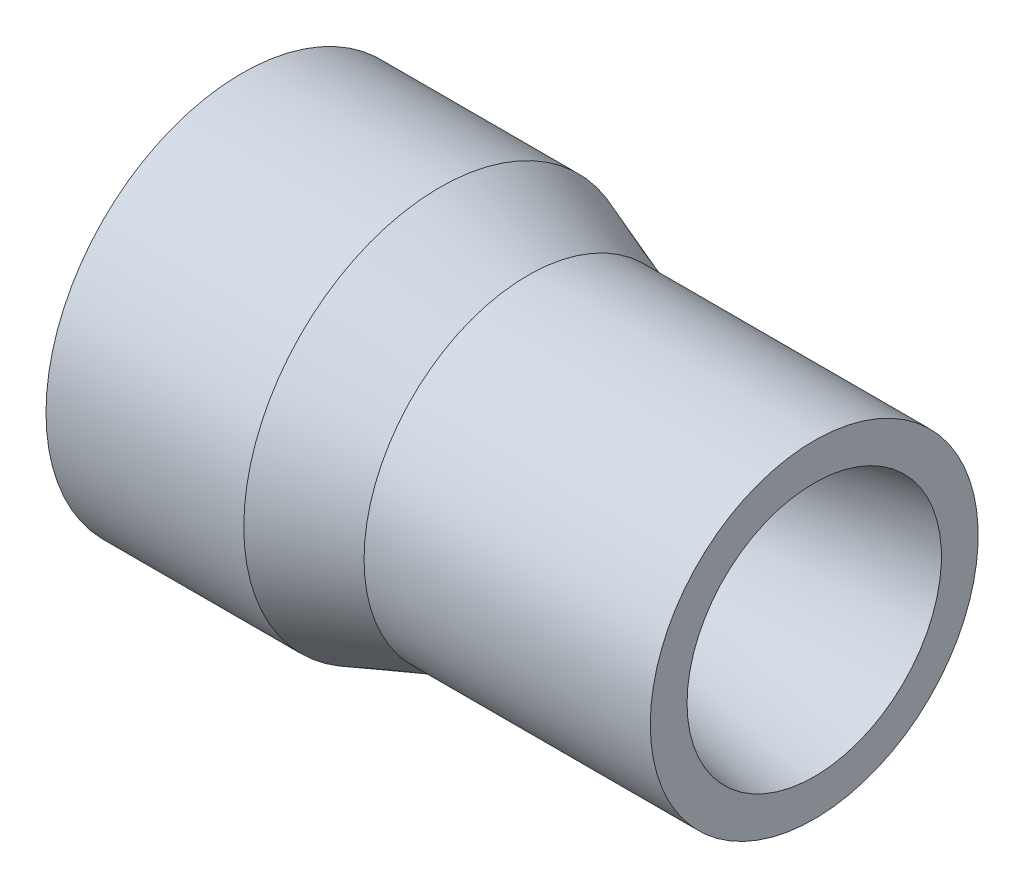
ISO-10303-21;
HEADER;
FILE_DESCRIPTION(('STEP AP214'),'2;1');
FILE_NAME('part.step','',(''),(''),'','','');
FILE_SCHEMA(('AUTOMOTIVE_DESIGN { 1 0 10303 214 1 1 1 1 }'));
ENDSEC;
DATA;
#1=APPLICATION_CONTEXT('core data for automotive mechanical design processes');
#2=APPLICATION_PROTOCOL_DEFINITION('international standard','automotive_design',2000,#1);
#3=PRODUCT_CONTEXT('',#1,'mechanical');
#4=PRODUCT('Part','Part','',(#3));
#5=PRODUCT_RELATED_PRODUCT_CATEGORY('part','',(#4));
#6=PRODUCT_DEFINITION_FORMATION('','',#4);
#7=PRODUCT_DEFINITION_CONTEXT('part definition',#1,'design');
#8=PRODUCT_DEFINITION('design','',#6,#7);
#9=PRODUCT_DEFINITION_SHAPE('','',#8);
#10=(LENGTH_UNIT() NAMED_UNIT(*) SI_UNIT(.MILLI.,.METRE.));
#11=(NAMED_UNIT(*) PLANE_ANGLE_UNIT() SI_UNIT($,.RADIAN.));
#12=(NAMED_UNIT(*) SI_UNIT($,.STERADIAN.) SOLID_ANGLE_UNIT());
#13=UNCERTAINTY_MEASURE_WITH_UNIT(LENGTH_MEASURE(1.E-05),#10,'distance_accuracy_value','');
#14=(GEOMETRIC_REPRESENTATION_CONTEXT(3) GLOBAL_UNCERTAINTY_ASSIGNED_CONTEXT((#13)) GLOBAL_UNIT_ASSIGNED_CONTEXT((#10,
#11,#12)) REPRESENTATION_CONTEXT('',''));
#15=CARTESIAN_POINT('',(0.,0.,0.));
#16=DIRECTION('',(0.,0.,1.));
#17=DIRECTION('',(1.,0.,0.));
#18=AXIS2_PLACEMENT_3D('',#15,#16,#17);
#19=CARTESIAN_POINT('',(0.140252987646805,0.,0.));
#20=DIRECTION('',(-1.,0.,0.));
#21=DIRECTION('',(0.,0.,1.));
#22=AXIS2_PLACEMENT_3D('',#19,#20,#21);
#23=DEGENERATE_TOROIDAL_SURFACE('',#22,44.3148851132243,85.61,.F.);
#24=CARTESIAN_POINT('',(42.9452529876469,0.,0.));
#25=DIRECTION('',(-1.,0.,0.));
#26=DIRECTION('',(0.,0.,1.));
#27=AXIS2_PLACEMENT_3D('',#24,#25,#26);
#28=CIRCLE('',#27,29.8255497047615);
#29=CARTESIAN_POINT('',(42.9452529876469,0.,29.8255497047615));
#30=VERTEX_POINT('',#29);
#31=EDGE_CURVE('E82',#30,#30,#28,.T.);
#32=ORIENTED_EDGE('',*,*,#31,.F.);
#33=EDGE_LOOP('',(#32));
#34=FACE_BOUND('',#33,.T.);
#35=CARTESIAN_POINT('',(0.,0.,0.));
#36=DIRECTION('',(-1.,0.,0.));
#37=DIRECTION('',(0.,0.,1.));
#38=AXIS2_PLACEMENT_3D('',#35,#36,#37);
#39=CIRCLE('',#38,41.295);
#40=CARTESIAN_POINT('',(0.,0.,41.295));
#41=VERTEX_POINT('',#40);
#42=EDGE_CURVE('E10',#41,#41,#39,.T.);
#43=ORIENTED_EDGE('',*,*,#42,.T.);
#44=EDGE_LOOP('',(#43));
#45=FACE_BOUND('',#44,.T.);
#46=ADVANCED_FACE('F39',(#34,#45),#23,.T.);
#47=CARTESIAN_POINT('',(0.,41.295,0.));
#48=DIRECTION('',(1.,0.,0.));
#49=DIRECTION('',(0.,0.,-1.));
#50=AXIS2_PLACEMENT_3D('',#47,#48,#49);
#51=PLANE('',#50);
#52=ORIENTED_EDGE('',*,*,#42,.F.);
#53=EDGE_LOOP('',(#52));
#54=FACE_BOUND('',#53,.T.);
#55=CARTESIAN_POINT('',(0.,0.,0.));
#56=DIRECTION('',(-1.,0.,0.));
#57=DIRECTION('',(0.,0.,1.));
#58=AXIS2_PLACEMENT_3D('',#55,#56,#57);
#59=CIRCLE('',#58,50.82);
#60=CARTESIAN_POINT('',(0.,0.,50.82));
#61=VERTEX_POINT('',#60);
#62=EDGE_CURVE('E46',#61,#61,#59,.T.);
#63=ORIENTED_EDGE('',*,*,#62,.T.);
#64=EDGE_LOOP('',(#63));
#65=FACE_BOUND('',#64,.T.);
#66=ADVANCED_FACE('F114',(#54,#65),#51,.F.);
#67=CARTESIAN_POINT('',(0.,0.,0.));
#68=DIRECTION('',(-1.,0.,0.));
#69=DIRECTION('',(0.,0.,1.));
#70=AXIS2_PLACEMENT_3D('',#67,#68,#69);
#71=CYLINDRICAL_SURFACE('',#70,50.82);
#72=ORIENTED_EDGE('',*,*,#62,.F.);
#73=EDGE_LOOP('',(#72));
#74=FACE_BOUND('',#73,.T.);
#75=CARTESIAN_POINT('',(51.2709878701376,0.,0.));
#76=DIRECTION('',(-1.,0.,0.));
#77=DIRECTION('',(0.,0.,1.));
#78=AXIS2_PLACEMENT_3D('',#75,#76,#77);
#79=CIRCLE('',#78,50.82);
#80=CARTESIAN_POINT('',(51.2709878701376,0.,50.82));
#81=VERTEX_POINT('',#80);
#82=EDGE_CURVE('E51',#81,#81,#79,.T.);
#83=ORIENTED_EDGE('',*,*,#82,.T.);
#84=EDGE_LOOP('',(#83));
#85=FACE_BOUND('',#84,.T.);
#86=ADVANCED_FACE('F111',(#74,#85),#71,.T.);
#87=CARTESIAN_POINT('',(74.13,0.,0.));
#88=DIRECTION('',(-1.,0.,0.));
#89=DIRECTION('',(0.,0.,1.));
#90=AXIS2_PLACEMENT_3D('',#87,#88,#89);
#91=CONICAL_SURFACE('',#90,42.5,0.349065850398867);
#92=ORIENTED_EDGE('',*,*,#82,.F.);
#93=EDGE_LOOP('',(#92));
#94=FACE_BOUND('',#93,.T.);
#95=CARTESIAN_POINT('',(74.13,0.,0.));
#96=DIRECTION('',(-1.,0.,0.));
#97=DIRECTION('',(0.,0.,1.));
#98=AXIS2_PLACEMENT_3D('',#95,#96,#97);
#99=CIRCLE('',#98,42.5);
#100=CARTESIAN_POINT('',(74.13,0.,42.5));
#101=VERTEX_POINT('',#100);
#102=EDGE_CURVE('E56',#101,#101,#99,.T.);
#103=ORIENTED_EDGE('',*,*,#102,.T.);
#104=EDGE_LOOP('',(#103));
#105=FACE_BOUND('',#104,.T.);
#106=ADVANCED_FACE('F107',(#94,#105),#91,.T.);
#107=CARTESIAN_POINT('',(0.,0.,0.));
#108=DIRECTION('',(-1.,0.,0.));
#109=DIRECTION('',(0.,0.,1.));
#110=AXIS2_PLACEMENT_3D('',#107,#108,#109);
#111=CYLINDRICAL_SURFACE('',#110,42.5);
#112=ORIENTED_EDGE('',*,*,#102,.F.);
#113=EDGE_LOOP('',(#112));
#114=FACE_BOUND('',#113,.T.);
#115=CARTESIAN_POINT('',(148.34,0.,0.));
#116=DIRECTION('',(-1.,0.,0.));
#117=DIRECTION('',(0.,0.,1.));
#118=AXIS2_PLACEMENT_3D('',#115,#116,#117);
#119=CIRCLE('',#118,42.5);
#120=CARTESIAN_POINT('',(148.34,0.,42.5));
#121=VERTEX_POINT('',#120);
#122=EDGE_CURVE('E62',#121,#121,#119,.T.);
#123=ORIENTED_EDGE('',*,*,#122,.T.);
#124=EDGE_LOOP('',(#123));
#125=FACE_BOUND('',#124,.T.);
#126=ADVANCED_FACE('F103',(#114,#125),#111,.T.);
#127=CARTESIAN_POINT('',(148.34,32.975,0.));
#128=DIRECTION('',(-1.,0.,0.));
#129=DIRECTION('',(0.,0.,1.));
#130=AXIS2_PLACEMENT_3D('',#127,#128,#129);
#131=PLANE('',#130);
#132=ORIENTED_EDGE('',*,*,#122,.F.);
#133=EDGE_LOOP('',(#132));
#134=FACE_BOUND('',#133,.T.);
#135=CARTESIAN_POINT('',(148.34,0.,0.));
#136=DIRECTION('',(-1.,0.,0.));
#137=DIRECTION('',(0.,0.,1.));
#138=AXIS2_PLACEMENT_3D('',#135,#136,#137);
#139=CIRCLE('',#138,32.975);
#140=CARTESIAN_POINT('',(148.34,0.,32.975));
#141=VERTEX_POINT('',#140);
#142=EDGE_CURVE('E66',#141,#141,#139,.T.);
#143=ORIENTED_EDGE('',*,*,#142,.T.);
#144=EDGE_LOOP('',(#143));
#145=FACE_BOUND('',#144,.T.);
#146=ADVANCED_FACE('F98',(#134,#145),#131,.F.);
#147=CARTESIAN_POINT('',(75.9337544172571,15.5587725866642,0.));
#148=CARTESIAN_POINT('',(97.1241869678697,22.9131894077849,0.));
#149=CARTESIAN_POINT('',(126.012294014913,29.8370455638665,0.));
#150=CARTESIAN_POINT('',(148.34,32.975,0.));
#151=B_SPLINE_CURVE_WITH_KNOTS('',3,(#147,#148,#149,#150),.UNSPECIFIED.,.F.,.F.,(4,4),(0.,1.),.UNSPECIFIED.);
#152=CARTESIAN_POINT('',(0.,0.,0.));
#153=DIRECTION('',(-1.,0.,0.));
#154=AXIS1_PLACEMENT('',#152,#153);
#155=SURFACE_OF_REVOLUTION('',#151,#154);
#156=ORIENTED_EDGE('',*,*,#142,.F.);
#157=EDGE_LOOP('',(#156));
#158=FACE_BOUND('',#157,.T.);
#159=CARTESIAN_POINT('',(75.9337544172571,0.,0.));
#160=DIRECTION('',(-1.,0.,0.));
#161=DIRECTION('',(0.,0.,1.));
#162=AXIS2_PLACEMENT_3D('',#159,#160,#161);
#163=CIRCLE('',#162,15.5587725866642);
#164=CARTESIAN_POINT('',(75.9337544172571,0.,15.5587725866642));
#165=VERTEX_POINT('',#164);
#166=EDGE_CURVE('E70',#165,#165,#163,.T.);
#167=ORIENTED_EDGE('',*,*,#166,.T.);
#168=EDGE_LOOP('',(#167));
#169=FACE_BOUND('',#168,.T.);
#170=ADVANCED_FACE('F93',(#158,#169),#155,.T.);
#171=CARTESIAN_POINT('',(74.1662796944015,0.,0.));
#172=DIRECTION('',(-1.,0.,0.));
#173=DIRECTION('',(0.,0.,1.));
#174=AXIS2_PLACEMENT_3D('',#171,#172,#173);
#175=TOROIDAL_SURFACE('',#174,21.1248873091674,5.84);
#176=ORIENTED_EDGE('',*,*,#166,.F.);
#177=EDGE_LOOP('',(#176));
#178=FACE_BOUND('',#177,.T.);
#179=CARTESIAN_POINT('',(74.13,0.,0.));
#180=DIRECTION('',(-1.,0.,0.));
#181=DIRECTION('',(0.,0.,1.));
#182=AXIS2_PLACEMENT_3D('',#179,#180,#181);
#183=CIRCLE('',#182,15.285);
#184=CARTESIAN_POINT('',(74.13,0.,15.285));
#185=VERTEX_POINT('',#184);
#186=EDGE_CURVE('E74',#185,#185,#183,.T.);
#187=ORIENTED_EDGE('',*,*,#186,.T.);
#188=EDGE_LOOP('',(#187));
#189=FACE_BOUND('',#188,.T.);
#190=ADVANCED_FACE('F97',(#178,#189),#175,.T.);
#191=CARTESIAN_POINT('',(74.2723853759731,0.,0.));
#192=DIRECTION('',(-1.,0.,0.));
#193=DIRECTION('',(0.,0.,1.));
#194=AXIS2_PLACEMENT_3D('',#191,#192,#193);
#195=TOROIDAL_SURFACE('',#194,38.2045577270747,22.92);
#196=ORIENTED_EDGE('',*,*,#186,.F.);
#197=EDGE_LOOP('',(#196));
#198=FACE_BOUND('',#197,.T.);
#199=CARTESIAN_POINT('',(62.8123853759731,0.,0.));
#200=DIRECTION('',(-1.,0.,0.));
#201=DIRECTION('',(0.,0.,1.));
#202=AXIS2_PLACEMENT_3D('',#199,#200,#201);
#203=CIRCLE('',#202,18.3552554723354);
#204=CARTESIAN_POINT('',(62.8123853759731,0.,18.3552554723354));
#205=VERTEX_POINT('',#204);
#206=EDGE_CURVE('E78',#205,#205,#203,.T.);
#207=ORIENTED_EDGE('',*,*,#206,.T.);
#208=EDGE_LOOP('',(#207));
#209=FACE_BOUND('',#208,.T.);
#210=ADVANCED_FACE('F128',(#198,#209),#195,.T.);
#211=CARTESIAN_POINT('',(42.9452529876469,0.,0.));
#212=DIRECTION('',(-1.,0.,0.));
#213=DIRECTION('',(0.,0.,1.));
#214=AXIS2_PLACEMENT_3D('',#211,#212,#213);
#215=CONICAL_SURFACE('',#214,29.8255497047615,0.5235987755983);
#216=ORIENTED_EDGE('',*,*,#206,.F.);
#217=EDGE_LOOP('',(#216));
#218=FACE_BOUND('',#217,.T.);
#219=ORIENTED_EDGE('',*,*,#31,.T.);
#220=EDGE_LOOP('',(#219));
#221=FACE_BOUND('',#220,.T.);
#222=ADVANCED_FACE('F126',(#218,#221),#215,.F.);
#223=CLOSED_SHELL('',(#46,#66,#86,#106,#126,#146,#170,#190,#210,#222));
#224=MANIFOLD_SOLID_BREP('B2',#223);
#225=ADVANCED_BREP_SHAPE_REPRESENTATION('',(#18,#224),#14);
#226=SHAPE_DEFINITION_REPRESENTATION(#9,#225);
ENDSEC;
END-ISO-10303-21;
